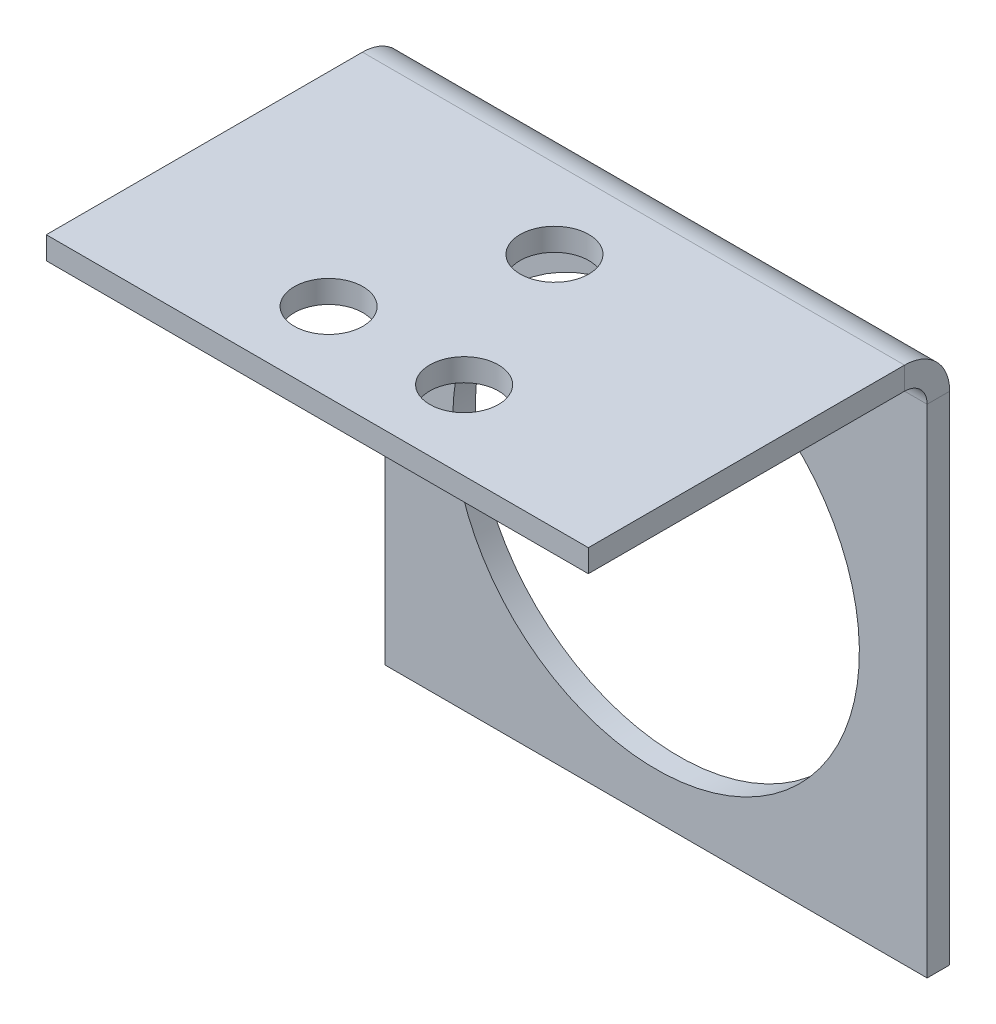
ISO-10303-21;
HEADER;
FILE_DESCRIPTION(('STEP AP214'),'2;1');
FILE_NAME('part.step','',(''),(''),'','','');
FILE_SCHEMA(('AUTOMOTIVE_DESIGN { 1 0 10303 214 1 1 1 1 }'));
ENDSEC;
DATA;
#1=APPLICATION_CONTEXT('core data for automotive mechanical design processes');
#2=APPLICATION_PROTOCOL_DEFINITION('international standard','automotive_design',2000,#1);
#3=PRODUCT_CONTEXT('',#1,'mechanical');
#4=PRODUCT('Part','Part','',(#3));
#5=PRODUCT_RELATED_PRODUCT_CATEGORY('part','',(#4));
#6=PRODUCT_DEFINITION_FORMATION('','',#4);
#7=PRODUCT_DEFINITION_CONTEXT('part definition',#1,'design');
#8=PRODUCT_DEFINITION('design','',#6,#7);
#9=PRODUCT_DEFINITION_SHAPE('','',#8);
#10=(LENGTH_UNIT() NAMED_UNIT(*) SI_UNIT(.MILLI.,.METRE.));
#11=(NAMED_UNIT(*) PLANE_ANGLE_UNIT() SI_UNIT($,.RADIAN.));
#12=(NAMED_UNIT(*) SI_UNIT($,.STERADIAN.) SOLID_ANGLE_UNIT());
#13=UNCERTAINTY_MEASURE_WITH_UNIT(LENGTH_MEASURE(1.E-05),#10,'distance_accuracy_value','');
#14=(GEOMETRIC_REPRESENTATION_CONTEXT(3) GLOBAL_UNCERTAINTY_ASSIGNED_CONTEXT((#13)) GLOBAL_UNIT_ASSIGNED_CONTEXT((#10,
#11,#12)) REPRESENTATION_CONTEXT('',''));
#15=CARTESIAN_POINT('',(0.,0.,0.));
#16=DIRECTION('',(0.,0.,1.));
#17=DIRECTION('',(1.,0.,0.));
#18=AXIS2_PLACEMENT_3D('',#15,#16,#17);
#19=CARTESIAN_POINT('',(38.1,-3.175,0.));
#20=DIRECTION('',(1.,0.,0.));
#21=DIRECTION('',(0.,0.,-1.));
#22=AXIS2_PLACEMENT_3D('',#19,#20,#21);
#23=PLANE('',#22);
#24=DIRECTION('',(0.,0.,1.));
#25=VECTOR('',#24,1.);
#26=CARTESIAN_POINT('',(38.1,-3.175,0.));
#27=LINE('',#26,#25);
#28=CARTESIAN_POINT('',(38.1,-3.175,0.));
#29=VERTEX_POINT('',#28);
#30=CARTESIAN_POINT('',(38.1,-3.175,1.5875));
#31=VERTEX_POINT('',#30);
#32=EDGE_CURVE('E11',#29,#31,#27,.T.);
#33=ORIENTED_EDGE('',*,*,#32,.F.);
#34=CARTESIAN_POINT('',(38.1,-3.175,3.175));
#35=DIRECTION('',(1.,0.,0.));
#36=DIRECTION('',(0.,0.,-1.));
#37=AXIS2_PLACEMENT_3D('',#34,#35,#36);
#38=CIRCLE('',#37,3.175);
#39=CARTESIAN_POINT('',(38.1,0.,3.175));
#40=VERTEX_POINT('',#39);
#41=EDGE_CURVE('E135',#40,#29,#38,.F.);
#42=ORIENTED_EDGE('',*,*,#41,.F.);
#43=DIRECTION('',(0.,1.,0.));
#44=VECTOR('',#43,1.);
#45=CARTESIAN_POINT('',(38.1,-1.5875,3.175));
#46=LINE('',#45,#44);
#47=CARTESIAN_POINT('',(38.1,-1.5875,3.175));
#48=VERTEX_POINT('',#47);
#49=EDGE_CURVE('E46',#48,#40,#46,.T.);
#50=ORIENTED_EDGE('',*,*,#49,.F.);
#51=CARTESIAN_POINT('',(38.1,-3.175,3.175));
#52=DIRECTION('',(1.,0.,0.));
#53=DIRECTION('',(0.,0.,-1.));
#54=AXIS2_PLACEMENT_3D('',#51,#52,#53);
#55=CIRCLE('',#54,1.5875);
#56=EDGE_CURVE('E128',#48,#31,#55,.F.);
#57=ORIENTED_EDGE('',*,*,#56,.T.);
#58=EDGE_LOOP('',(#33,#42,#50,#57));
#59=FACE_BOUND('',#58,.T.);
#60=ADVANCED_FACE('F38',(#59),#23,.T.);
#61=CARTESIAN_POINT('',(38.1,-1.5875,3.175));
#62=DIRECTION('',(1.,0.,0.));
#63=DIRECTION('',(0.,0.,-1.));
#64=AXIS2_PLACEMENT_3D('',#61,#62,#63);
#65=PLANE('',#64);
#66=DIRECTION('',(0.,-1.,0.));
#67=VECTOR('',#66,1.);
#68=CARTESIAN_POINT('',(38.1,0.,0.));
#69=LINE('',#68,#67);
#70=CARTESIAN_POINT('',(38.1,-38.1,0.));
#71=VERTEX_POINT('',#70);
#72=EDGE_CURVE('E185',#29,#71,#69,.T.);
#73=ORIENTED_EDGE('',*,*,#72,.F.);
#74=ORIENTED_EDGE('',*,*,#32,.T.);
#75=DIRECTION('',(0.,-1.,0.));
#76=VECTOR('',#75,1.);
#77=CARTESIAN_POINT('',(38.1,0.,1.5875));
#78=LINE('',#77,#76);
#79=CARTESIAN_POINT('',(38.1,-38.1,1.5875));
#80=VERTEX_POINT('',#79);
#81=EDGE_CURVE('E94',#31,#80,#78,.T.);
#82=ORIENTED_EDGE('',*,*,#81,.T.);
#83=DIRECTION('',(0.,0.,1.));
#84=VECTOR('',#83,1.);
#85=CARTESIAN_POINT('',(38.1,-38.1,0.));
#86=LINE('',#85,#84);
#87=EDGE_CURVE('E417',#71,#80,#86,.T.);
#88=ORIENTED_EDGE('',*,*,#87,.F.);
#89=EDGE_LOOP('',(#73,#74,#82,#88));
#90=FACE_BOUND('',#89,.T.);
#91=ADVANCED_FACE('F193',(#90),#65,.T.);
#92=CARTESIAN_POINT('',(0.,0.,3.175));
#93=DIRECTION('',(-1.,0.,0.));
#94=DIRECTION('',(0.,0.,1.));
#95=AXIS2_PLACEMENT_3D('',#92,#93,#94);
#96=PLANE('',#95);
#97=DIRECTION('',(0.,-1.,0.));
#98=VECTOR('',#97,1.);
#99=CARTESIAN_POINT('',(0.,0.,3.175));
#100=LINE('',#99,#98);
#101=CARTESIAN_POINT('',(0.,0.,3.175));
#102=VERTEX_POINT('',#101);
#103=CARTESIAN_POINT('',(0.,-1.5875,3.175));
#104=VERTEX_POINT('',#103);
#105=EDGE_CURVE('E81',#102,#104,#100,.T.);
#106=ORIENTED_EDGE('',*,*,#105,.F.);
#107=CARTESIAN_POINT('',(0.,-3.175,3.175));
#108=DIRECTION('',(1.,0.,0.));
#109=DIRECTION('',(0.,0.,-1.));
#110=AXIS2_PLACEMENT_3D('',#107,#108,#109);
#111=CIRCLE('',#110,3.175);
#112=CARTESIAN_POINT('',(0.,-3.175,0.));
#113=VERTEX_POINT('',#112);
#114=EDGE_CURVE('E151',#102,#113,#111,.F.);
#115=ORIENTED_EDGE('',*,*,#114,.T.);
#116=DIRECTION('',(0.,0.,-1.));
#117=VECTOR('',#116,1.);
#118=CARTESIAN_POINT('',(0.,-3.175,1.5875));
#119=LINE('',#118,#117);
#120=CARTESIAN_POINT('',(0.,-3.175,1.5875));
#121=VERTEX_POINT('',#120);
#122=EDGE_CURVE('E88',#121,#113,#119,.T.);
#123=ORIENTED_EDGE('',*,*,#122,.F.);
#124=CARTESIAN_POINT('',(0.,-3.175,3.175));
#125=DIRECTION('',(1.,0.,0.));
#126=DIRECTION('',(0.,0.,-1.));
#127=AXIS2_PLACEMENT_3D('',#124,#125,#126);
#128=CIRCLE('',#127,1.5875);
#129=EDGE_CURVE('E158',#104,#121,#128,.F.);
#130=ORIENTED_EDGE('',*,*,#129,.F.);
#131=EDGE_LOOP('',(#106,#115,#123,#130));
#132=FACE_BOUND('',#131,.T.);
#133=ADVANCED_FACE('F191',(#132),#96,.T.);
#134=CARTESIAN_POINT('',(0.,-3.175,1.5875));
#135=DIRECTION('',(-1.,0.,0.));
#136=DIRECTION('',(0.,0.,1.));
#137=AXIS2_PLACEMENT_3D('',#134,#135,#136);
#138=PLANE('',#137);
#139=DIRECTION('',(0.,0.,-1.));
#140=VECTOR('',#139,1.);
#141=CARTESIAN_POINT('',(0.,0.,25.4));
#142=LINE('',#141,#140);
#143=CARTESIAN_POINT('',(0.,0.,25.4));
#144=VERTEX_POINT('',#143);
#145=EDGE_CURVE('E153',#144,#102,#142,.T.);
#146=ORIENTED_EDGE('',*,*,#145,.T.);
#147=ORIENTED_EDGE('',*,*,#105,.T.);
#148=DIRECTION('',(0.,0.,-1.));
#149=VECTOR('',#148,1.);
#150=CARTESIAN_POINT('',(0.,-1.5875,25.4));
#151=LINE('',#150,#149);
#152=CARTESIAN_POINT('',(0.,-1.5875,25.4));
#153=VERTEX_POINT('',#152);
#154=EDGE_CURVE('E156',#153,#104,#151,.T.);
#155=ORIENTED_EDGE('',*,*,#154,.F.);
#156=DIRECTION('',(0.,1.,0.));
#157=VECTOR('',#156,1.);
#158=CARTESIAN_POINT('',(0.,-1.5875,25.4));
#159=LINE('',#158,#157);
#160=EDGE_CURVE('E116',#153,#144,#159,.T.);
#161=ORIENTED_EDGE('',*,*,#160,.T.);
#162=EDGE_LOOP('',(#146,#147,#155,#161));
#163=FACE_BOUND('',#162,.T.);
#164=ADVANCED_FACE('F187',(#163),#138,.T.);
#165=CARTESIAN_POINT('',(38.1,0.,1.5875));
#166=DIRECTION('',(0.,0.,-1.));
#167=DIRECTION('',(0.,1.,0.));
#168=AXIS2_PLACEMENT_3D('',#165,#166,#167);
#169=PLANE('',#168);
#170=CARTESIAN_POINT('',(19.05,-20.6375,1.5875));
#171=DIRECTION('',(0.,0.,-1.));
#172=DIRECTION('',(0.,1.,0.));
#173=AXIS2_PLACEMENT_3D('',#170,#171,#172);
#174=CIRCLE('',#173,14.2875);
#175=CARTESIAN_POINT('',(19.05,-6.34999999999999,1.5875));
#176=VERTEX_POINT('',#175);
#177=EDGE_CURVE('E392',#176,#176,#174,.T.);
#178=ORIENTED_EDGE('',*,*,#177,.T.);
#179=EDGE_LOOP('',(#178));
#180=FACE_BOUND('',#179,.T.);
#181=DIRECTION('',(0.,-1.,0.));
#182=VECTOR('',#181,1.);
#183=CARTESIAN_POINT('',(0.,0.,1.5875));
#184=LINE('',#183,#182);
#185=CARTESIAN_POINT('',(0.,-38.1,1.5875));
#186=VERTEX_POINT('',#185);
#187=EDGE_CURVE('E141',#121,#186,#184,.T.);
#188=ORIENTED_EDGE('',*,*,#187,.T.);
#189=DIRECTION('',(-1.,0.,0.));
#190=VECTOR('',#189,1.);
#191=CARTESIAN_POINT('',(38.1,-38.1,1.5875));
#192=LINE('',#191,#190);
#193=EDGE_CURVE('E172',#80,#186,#192,.T.);
#194=ORIENTED_EDGE('',*,*,#193,.F.);
#195=ORIENTED_EDGE('',*,*,#81,.F.);
#196=DIRECTION('',(-1.,0.,0.));
#197=VECTOR('',#196,1.);
#198=CARTESIAN_POINT('',(38.1,-3.175,1.5875));
#199=LINE('',#198,#197);
#200=EDGE_CURVE('E140',#31,#121,#199,.T.);
#201=ORIENTED_EDGE('',*,*,#200,.T.);
#202=EDGE_LOOP('',(#188,#194,#195,#201));
#203=FACE_BOUND('',#202,.T.);
#204=ADVANCED_FACE('F199',(#180,#203),#169,.F.);
#205=CARTESIAN_POINT('',(38.1,-38.1,0.));
#206=DIRECTION('',(0.,-1.,0.));
#207=DIRECTION('',(0.,0.,-1.));
#208=AXIS2_PLACEMENT_3D('',#205,#206,#207);
#209=PLANE('',#208);
#210=DIRECTION('',(0.,0.,1.));
#211=VECTOR('',#210,1.);
#212=CARTESIAN_POINT('',(0.,-38.1,0.));
#213=LINE('',#212,#211);
#214=CARTESIAN_POINT('',(0.,-38.1,0.));
#215=VERTEX_POINT('',#214);
#216=EDGE_CURVE('E144',#215,#186,#213,.T.);
#217=ORIENTED_EDGE('',*,*,#216,.F.);
#218=DIRECTION('',(-1.,0.,0.));
#219=VECTOR('',#218,1.);
#220=CARTESIAN_POINT('',(38.1,-38.1,0.));
#221=LINE('',#220,#219);
#222=EDGE_CURVE('E170',#71,#215,#221,.T.);
#223=ORIENTED_EDGE('',*,*,#222,.F.);
#224=ORIENTED_EDGE('',*,*,#87,.T.);
#225=ORIENTED_EDGE('',*,*,#193,.T.);
#226=EDGE_LOOP('',(#217,#223,#224,#225));
#227=FACE_BOUND('',#226,.T.);
#228=ADVANCED_FACE('F228',(#227),#209,.T.);
#229=CARTESIAN_POINT('',(38.1,0.,0.));
#230=DIRECTION('',(0.,0.,-1.));
#231=DIRECTION('',(0.,1.,0.));
#232=AXIS2_PLACEMENT_3D('',#229,#230,#231);
#233=PLANE('',#232);
#234=CARTESIAN_POINT('',(19.05,-20.6375,0.));
#235=DIRECTION('',(0.,0.,-1.));
#236=DIRECTION('',(0.,1.,0.));
#237=AXIS2_PLACEMENT_3D('',#234,#235,#236);
#238=CIRCLE('',#237,14.2875);
#239=CARTESIAN_POINT('',(19.05,-6.34999999999999,0.));
#240=VERTEX_POINT('',#239);
#241=EDGE_CURVE('E395',#240,#240,#238,.T.);
#242=ORIENTED_EDGE('',*,*,#241,.F.);
#243=EDGE_LOOP('',(#242));
#244=FACE_BOUND('',#243,.T.);
#245=DIRECTION('',(0.,-1.,0.));
#246=VECTOR('',#245,1.);
#247=CARTESIAN_POINT('',(0.,0.,0.));
#248=LINE('',#247,#246);
#249=EDGE_CURVE('E148',#113,#215,#248,.T.);
#250=ORIENTED_EDGE('',*,*,#249,.F.);
#251=DIRECTION('',(-1.,0.,0.));
#252=VECTOR('',#251,1.);
#253=CARTESIAN_POINT('',(38.1,-3.175,0.));
#254=LINE('',#253,#252);
#255=EDGE_CURVE('E167',#29,#113,#254,.T.);
#256=ORIENTED_EDGE('',*,*,#255,.F.);
#257=ORIENTED_EDGE('',*,*,#72,.T.);
#258=ORIENTED_EDGE('',*,*,#222,.T.);
#259=EDGE_LOOP('',(#250,#256,#257,#258));
#260=FACE_BOUND('',#259,.T.);
#261=ADVANCED_FACE('F233',(#244,#260),#233,.T.);
#262=CARTESIAN_POINT('',(38.1,-3.175,3.175));
#263=DIRECTION('',(-1.,0.,0.));
#264=DIRECTION('',(0.,0.,1.));
#265=AXIS2_PLACEMENT_3D('',#262,#263,#264);
#266=CYLINDRICAL_SURFACE('',#265,3.175);
#267=ORIENTED_EDGE('',*,*,#114,.F.);
#268=DIRECTION('',(-1.,0.,0.));
#269=VECTOR('',#268,1.);
#270=CARTESIAN_POINT('',(38.1,0.,3.175));
#271=LINE('',#270,#269);
#272=EDGE_CURVE('E164',#40,#102,#271,.T.);
#273=ORIENTED_EDGE('',*,*,#272,.F.);
#274=ORIENTED_EDGE('',*,*,#41,.T.);
#275=ORIENTED_EDGE('',*,*,#255,.T.);
#276=EDGE_LOOP('',(#267,#273,#274,#275));
#277=FACE_BOUND('',#276,.T.);
#278=ADVANCED_FACE('F181',(#277),#266,.T.);
#279=CARTESIAN_POINT('',(38.1,0.,25.4));
#280=DIRECTION('',(0.,1.,0.));
#281=DIRECTION('',(0.,0.,1.));
#282=AXIS2_PLACEMENT_3D('',#279,#280,#281);
#283=PLANE('',#282);
#284=CARTESIAN_POINT('',(14.2875,0.,19.84375));
#285=DIRECTION('',(0.,1.,0.));
#286=DIRECTION('',(0.,0.,1.));
#287=AXIS2_PLACEMENT_3D('',#284,#285,#286);
#288=CIRCLE('',#287,2.413);
#289=CARTESIAN_POINT('',(14.2875,0.,22.25675));
#290=VERTEX_POINT('',#289);
#291=EDGE_CURVE('E397',#290,#290,#288,.T.);
#292=ORIENTED_EDGE('',*,*,#291,.F.);
#293=EDGE_LOOP('',(#292));
#294=FACE_BOUND('',#293,.T.);
#295=CARTESIAN_POINT('',(19.05,0.,8.73125));
#296=DIRECTION('',(0.,1.,0.));
#297=DIRECTION('',(0.,0.,1.));
#298=AXIS2_PLACEMENT_3D('',#295,#296,#297);
#299=CIRCLE('',#298,2.413);
#300=CARTESIAN_POINT('',(19.05,0.,11.14425));
#301=VERTEX_POINT('',#300);
#302=EDGE_CURVE('E403',#301,#301,#299,.T.);
#303=ORIENTED_EDGE('',*,*,#302,.F.);
#304=EDGE_LOOP('',(#303));
#305=FACE_BOUND('',#304,.T.);
#306=CARTESIAN_POINT('',(23.8125,0.,19.84375));
#307=DIRECTION('',(0.,1.,0.));
#308=DIRECTION('',(0.,0.,1.));
#309=AXIS2_PLACEMENT_3D('',#306,#307,#308);
#310=CIRCLE('',#309,2.413);
#311=CARTESIAN_POINT('',(23.8125,0.,22.25675));
#312=VERTEX_POINT('',#311);
#313=EDGE_CURVE('E409',#312,#312,#310,.T.);
#314=ORIENTED_EDGE('',*,*,#313,.F.);
#315=EDGE_LOOP('',(#314));
#316=FACE_BOUND('',#315,.T.);
#317=ORIENTED_EDGE('',*,*,#145,.F.);
#318=DIRECTION('',(-1.,0.,0.));
#319=VECTOR('',#318,1.);
#320=CARTESIAN_POINT('',(38.1,0.,25.4));
#321=LINE('',#320,#319);
#322=CARTESIAN_POINT('',(38.1,0.,25.4));
#323=VERTEX_POINT('',#322);
#324=EDGE_CURVE('E118',#323,#144,#321,.T.);
#325=ORIENTED_EDGE('',*,*,#324,.F.);
#326=DIRECTION('',(0.,0.,-1.));
#327=VECTOR('',#326,1.);
#328=CARTESIAN_POINT('',(38.1,0.,25.4));
#329=LINE('',#328,#327);
#330=EDGE_CURVE('E133',#323,#40,#329,.T.);
#331=ORIENTED_EDGE('',*,*,#330,.T.);
#332=ORIENTED_EDGE('',*,*,#272,.T.);
#333=EDGE_LOOP('',(#317,#325,#331,#332));
#334=FACE_BOUND('',#333,.T.);
#335=ADVANCED_FACE('F186',(#294,#305,#316,#334),#283,.T.);
#336=CARTESIAN_POINT('',(38.1,-1.5875,25.4));
#337=DIRECTION('',(0.,0.,1.));
#338=DIRECTION('',(1.,0.,0.));
#339=AXIS2_PLACEMENT_3D('',#336,#337,#338);
#340=PLANE('',#339);
#341=ORIENTED_EDGE('',*,*,#160,.F.);
#342=DIRECTION('',(-1.,0.,0.));
#343=VECTOR('',#342,1.);
#344=CARTESIAN_POINT('',(38.1,-1.5875,25.4));
#345=LINE('',#344,#343);
#346=CARTESIAN_POINT('',(38.1,-1.5875,25.4));
#347=VERTEX_POINT('',#346);
#348=EDGE_CURVE('E110',#347,#153,#345,.T.);
#349=ORIENTED_EDGE('',*,*,#348,.F.);
#350=DIRECTION('',(0.,1.,0.));
#351=VECTOR('',#350,1.);
#352=CARTESIAN_POINT('',(38.1,-1.5875,25.4));
#353=LINE('',#352,#351);
#354=EDGE_CURVE('E114',#347,#323,#353,.T.);
#355=ORIENTED_EDGE('',*,*,#354,.T.);
#356=ORIENTED_EDGE('',*,*,#324,.T.);
#357=EDGE_LOOP('',(#341,#349,#355,#356));
#358=FACE_BOUND('',#357,.T.);
#359=ADVANCED_FACE('F112',(#358),#340,.T.);
#360=CARTESIAN_POINT('',(38.1,-1.5875,25.4));
#361=DIRECTION('',(0.,1.,0.));
#362=DIRECTION('',(0.,0.,1.));
#363=AXIS2_PLACEMENT_3D('',#360,#361,#362);
#364=PLANE('',#363);
#365=CARTESIAN_POINT('',(14.2875,-1.5875,19.84375));
#366=DIRECTION('',(0.,1.,0.));
#367=DIRECTION('',(0.,0.,1.));
#368=AXIS2_PLACEMENT_3D('',#365,#366,#367);
#369=CIRCLE('',#368,2.413);
#370=CARTESIAN_POINT('',(14.2875,-1.5875,22.25675));
#371=VERTEX_POINT('',#370);
#372=EDGE_CURVE('E400',#371,#371,#369,.T.);
#373=ORIENTED_EDGE('',*,*,#372,.T.);
#374=EDGE_LOOP('',(#373));
#375=FACE_BOUND('',#374,.T.);
#376=CARTESIAN_POINT('',(19.05,-1.5875,8.73125));
#377=DIRECTION('',(0.,1.,0.));
#378=DIRECTION('',(0.,0.,1.));
#379=AXIS2_PLACEMENT_3D('',#376,#377,#378);
#380=CIRCLE('',#379,2.413);
#381=CARTESIAN_POINT('',(19.05,-1.5875,11.14425));
#382=VERTEX_POINT('',#381);
#383=EDGE_CURVE('E406',#382,#382,#380,.T.);
#384=ORIENTED_EDGE('',*,*,#383,.T.);
#385=EDGE_LOOP('',(#384));
#386=FACE_BOUND('',#385,.T.);
#387=CARTESIAN_POINT('',(23.8125,-1.5875,19.84375));
#388=DIRECTION('',(0.,1.,0.));
#389=DIRECTION('',(0.,0.,1.));
#390=AXIS2_PLACEMENT_3D('',#387,#388,#389);
#391=CIRCLE('',#390,2.413);
#392=CARTESIAN_POINT('',(23.8125,-1.5875,22.25675));
#393=VERTEX_POINT('',#392);
#394=EDGE_CURVE('E145',#393,#393,#391,.T.);
#395=ORIENTED_EDGE('',*,*,#394,.T.);
#396=EDGE_LOOP('',(#395));
#397=FACE_BOUND('',#396,.T.);
#398=ORIENTED_EDGE('',*,*,#154,.T.);
#399=DIRECTION('',(-1.,0.,0.));
#400=VECTOR('',#399,1.);
#401=CARTESIAN_POINT('',(38.1,-1.5875,3.175));
#402=LINE('',#401,#400);
#403=EDGE_CURVE('E119',#48,#104,#402,.T.);
#404=ORIENTED_EDGE('',*,*,#403,.F.);
#405=DIRECTION('',(0.,0.,-1.));
#406=VECTOR('',#405,1.);
#407=CARTESIAN_POINT('',(38.1,-1.5875,25.4));
#408=LINE('',#407,#406);
#409=EDGE_CURVE('E123',#347,#48,#408,.T.);
#410=ORIENTED_EDGE('',*,*,#409,.F.);
#411=ORIENTED_EDGE('',*,*,#348,.T.);
#412=EDGE_LOOP('',(#398,#404,#410,#411));
#413=FACE_BOUND('',#412,.T.);
#414=ADVANCED_FACE('F124',(#375,#386,#397,#413),#364,.F.);
#415=CARTESIAN_POINT('',(38.1,-3.175,3.175));
#416=DIRECTION('',(-1.,0.,0.));
#417=DIRECTION('',(0.,0.,1.));
#418=AXIS2_PLACEMENT_3D('',#415,#416,#417);
#419=CYLINDRICAL_SURFACE('',#418,1.5875);
#420=ORIENTED_EDGE('',*,*,#129,.T.);
#421=ORIENTED_EDGE('',*,*,#200,.F.);
#422=ORIENTED_EDGE('',*,*,#56,.F.);
#423=ORIENTED_EDGE('',*,*,#403,.T.);
#424=EDGE_LOOP('',(#420,#421,#422,#423));
#425=FACE_BOUND('',#424,.T.);
#426=ADVANCED_FACE('F189',(#425),#419,.F.);
#427=CARTESIAN_POINT('',(38.1,-3.175,3.175));
#428=DIRECTION('',(1.,0.,0.));
#429=DIRECTION('',(0.,0.,-1.));
#430=AXIS2_PLACEMENT_3D('',#427,#428,#429);
#431=PLANE('',#430);
#432=ORIENTED_EDGE('',*,*,#409,.T.);
#433=ORIENTED_EDGE('',*,*,#49,.T.);
#434=ORIENTED_EDGE('',*,*,#330,.F.);
#435=ORIENTED_EDGE('',*,*,#354,.F.);
#436=EDGE_LOOP('',(#432,#433,#434,#435));
#437=FACE_BOUND('',#436,.T.);
#438=ADVANCED_FACE('F131',(#437),#431,.T.);
#439=CARTESIAN_POINT('',(0.,-3.175,3.175));
#440=DIRECTION('',(1.,0.,0.));
#441=DIRECTION('',(0.,0.,-1.));
#442=AXIS2_PLACEMENT_3D('',#439,#440,#441);
#443=PLANE('',#442);
#444=ORIENTED_EDGE('',*,*,#187,.F.);
#445=ORIENTED_EDGE('',*,*,#122,.T.);
#446=ORIENTED_EDGE('',*,*,#249,.T.);
#447=ORIENTED_EDGE('',*,*,#216,.T.);
#448=EDGE_LOOP('',(#444,#445,#446,#447));
#449=FACE_BOUND('',#448,.T.);
#450=ADVANCED_FACE('F277',(#449),#443,.F.);
#451=CARTESIAN_POINT('',(23.8125,-1.5875,19.84375));
#452=DIRECTION('',(0.,1.,0.));
#453=DIRECTION('',(0.,0.,1.));
#454=AXIS2_PLACEMENT_3D('',#451,#452,#453);
#455=CYLINDRICAL_SURFACE('',#454,2.413);
#456=ORIENTED_EDGE('',*,*,#394,.F.);
#457=EDGE_LOOP('',(#456));
#458=FACE_BOUND('',#457,.T.);
#459=ORIENTED_EDGE('',*,*,#313,.T.);
#460=EDGE_LOOP('',(#459));
#461=FACE_BOUND('',#460,.T.);
#462=ADVANCED_FACE('F287',(#458,#461),#455,.F.);
#463=CARTESIAN_POINT('',(19.05,-1.5875,8.73125));
#464=DIRECTION('',(0.,1.,0.));
#465=DIRECTION('',(0.,0.,1.));
#466=AXIS2_PLACEMENT_3D('',#463,#464,#465);
#467=CYLINDRICAL_SURFACE('',#466,2.413);
#468=ORIENTED_EDGE('',*,*,#383,.F.);
#469=EDGE_LOOP('',(#468));
#470=FACE_BOUND('',#469,.T.);
#471=ORIENTED_EDGE('',*,*,#302,.T.);
#472=EDGE_LOOP('',(#471));
#473=FACE_BOUND('',#472,.T.);
#474=ADVANCED_FACE('F314',(#470,#473),#467,.F.);
#475=CARTESIAN_POINT('',(14.2875,-1.5875,19.84375));
#476=DIRECTION('',(0.,1.,0.));
#477=DIRECTION('',(0.,0.,1.));
#478=AXIS2_PLACEMENT_3D('',#475,#476,#477);
#479=CYLINDRICAL_SURFACE('',#478,2.413);
#480=ORIENTED_EDGE('',*,*,#372,.F.);
#481=EDGE_LOOP('',(#480));
#482=FACE_BOUND('',#481,.T.);
#483=ORIENTED_EDGE('',*,*,#291,.T.);
#484=EDGE_LOOP('',(#483));
#485=FACE_BOUND('',#484,.T.);
#486=ADVANCED_FACE('F325',(#482,#485),#479,.F.);
#487=CARTESIAN_POINT('',(19.05,-20.6375,1.5875));
#488=DIRECTION('',(0.,0.,-1.));
#489=DIRECTION('',(0.,1.,0.));
#490=AXIS2_PLACEMENT_3D('',#487,#488,#489);
#491=CYLINDRICAL_SURFACE('',#490,14.2875);
#492=ORIENTED_EDGE('',*,*,#177,.F.);
#493=EDGE_LOOP('',(#492));
#494=FACE_BOUND('',#493,.T.);
#495=ORIENTED_EDGE('',*,*,#241,.T.);
#496=EDGE_LOOP('',(#495));
#497=FACE_BOUND('',#496,.T.);
#498=ADVANCED_FACE('F336',(#494,#497),#491,.F.);
#499=CLOSED_SHELL('',(#60,#91,#133,#164,#204,#228,#261,#278,#335,#359,#414,#426,#438,#450,#462,
#474,#486,#498));
#500=MANIFOLD_SOLID_BREP('B2',#499);
#501=ADVANCED_BREP_SHAPE_REPRESENTATION('',(#18,#500),#14);
#502=SHAPE_DEFINITION_REPRESENTATION(#9,#501);
ENDSEC;
END-ISO-10303-21;
